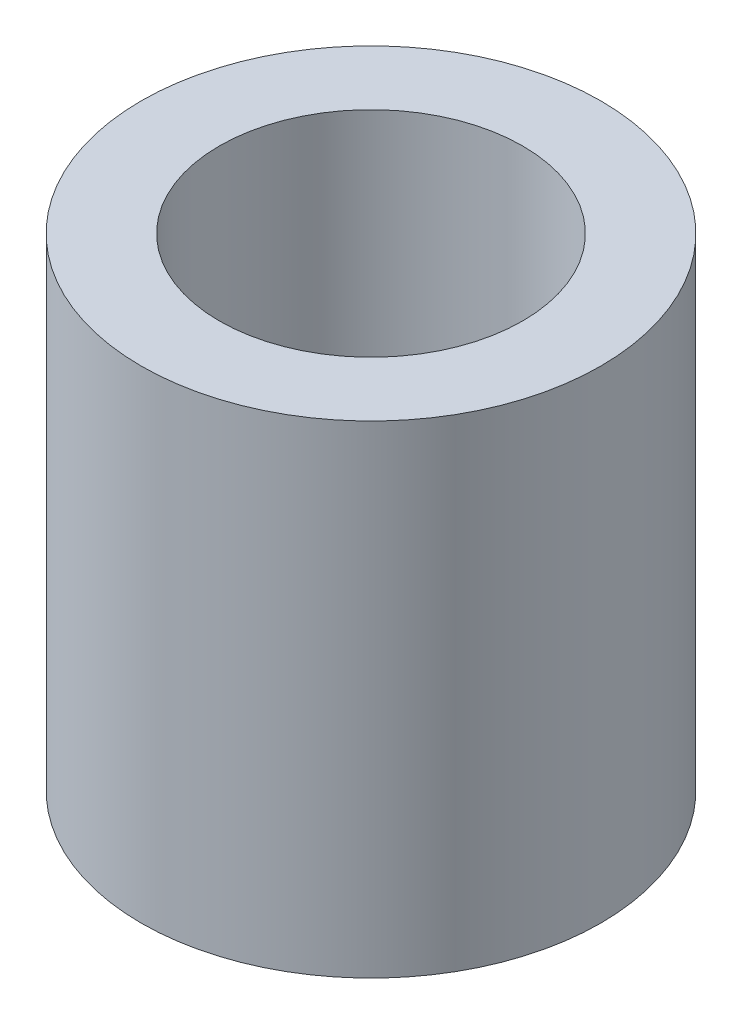
ISO-10303-21;
HEADER;
FILE_DESCRIPTION(('STEP AP214'),'2;1');
FILE_NAME('part.step','',(''),(''),'','','');
FILE_SCHEMA(('AUTOMOTIVE_DESIGN { 1 0 10303 214 1 1 1 1 }'));
ENDSEC;
DATA;
#1=APPLICATION_CONTEXT('core data for automotive mechanical design processes');
#2=APPLICATION_PROTOCOL_DEFINITION('international standard','automotive_design',2000,#1);
#3=PRODUCT_CONTEXT('',#1,'mechanical');
#4=PRODUCT('Part','Part','',(#3));
#5=PRODUCT_RELATED_PRODUCT_CATEGORY('part','',(#4));
#6=PRODUCT_DEFINITION_FORMATION('','',#4);
#7=PRODUCT_DEFINITION_CONTEXT('part definition',#1,'design');
#8=PRODUCT_DEFINITION('design','',#6,#7);
#9=PRODUCT_DEFINITION_SHAPE('','',#8);
#10=(LENGTH_UNIT() NAMED_UNIT(*) SI_UNIT(.MILLI.,.METRE.));
#11=(NAMED_UNIT(*) PLANE_ANGLE_UNIT() SI_UNIT($,.RADIAN.));
#12=(NAMED_UNIT(*) SI_UNIT($,.STERADIAN.) SOLID_ANGLE_UNIT());
#13=UNCERTAINTY_MEASURE_WITH_UNIT(LENGTH_MEASURE(1.E-05),#10,'distance_accuracy_value','');
#14=(GEOMETRIC_REPRESENTATION_CONTEXT(3) GLOBAL_UNCERTAINTY_ASSIGNED_CONTEXT((#13)) GLOBAL_UNIT_ASSIGNED_CONTEXT((#10,
#11,#12)) REPRESENTATION_CONTEXT('',''));
#15=CARTESIAN_POINT('',(0.,0.,0.));
#16=DIRECTION('',(0.,0.,1.));
#17=DIRECTION('',(1.,0.,0.));
#18=AXIS2_PLACEMENT_3D('',#15,#16,#17);
#19=CARTESIAN_POINT('',(0.,5.25,0.));
#20=DIRECTION('',(0.,1.,0.));
#21=DIRECTION('',(0.,0.,1.));
#22=AXIS2_PLACEMENT_3D('',#19,#20,#21);
#23=PLANE('',#22);
#24=CARTESIAN_POINT('',(0.,5.25,0.));
#25=DIRECTION('',(0.,1.,0.));
#26=DIRECTION('',(0.,0.,1.));
#27=AXIS2_PLACEMENT_3D('',#24,#25,#26);
#28=CIRCLE('',#27,2.5);
#29=CARTESIAN_POINT('',(0.,5.25,-2.5));
#30=VERTEX_POINT('',#29);
#31=EDGE_CURVE('E10',#30,#30,#28,.T.);
#32=ORIENTED_EDGE('',*,*,#31,.T.);
#33=EDGE_LOOP('',(#32));
#34=FACE_BOUND('',#33,.T.);
#35=CARTESIAN_POINT('',(0.,5.25,0.));
#36=DIRECTION('',(0.,1.,0.));
#37=DIRECTION('',(0.,0.,1.));
#38=AXIS2_PLACEMENT_3D('',#35,#36,#37);
#39=CIRCLE('',#38,1.65);
#40=CARTESIAN_POINT('',(0.,5.25,-1.65));
#41=VERTEX_POINT('',#40);
#42=EDGE_CURVE('E42',#41,#41,#39,.T.);
#43=ORIENTED_EDGE('',*,*,#42,.F.);
#44=EDGE_LOOP('',(#43));
#45=FACE_BOUND('',#44,.T.);
#46=ADVANCED_FACE('F31',(#34,#45),#23,.T.);
#47=CARTESIAN_POINT('',(0.,0.,0.));
#48=DIRECTION('',(0.,1.,0.));
#49=DIRECTION('',(0.,0.,1.));
#50=AXIS2_PLACEMENT_3D('',#47,#48,#49);
#51=PLANE('',#50);
#52=CARTESIAN_POINT('',(0.,0.,0.));
#53=DIRECTION('',(0.,1.,0.));
#54=DIRECTION('',(0.,0.,1.));
#55=AXIS2_PLACEMENT_3D('',#52,#53,#54);
#56=CIRCLE('',#55,2.5);
#57=CARTESIAN_POINT('',(0.,0.,-2.5));
#58=VERTEX_POINT('',#57);
#59=EDGE_CURVE('E35',#58,#58,#56,.T.);
#60=ORIENTED_EDGE('',*,*,#59,.F.);
#61=EDGE_LOOP('',(#60));
#62=FACE_BOUND('',#61,.T.);
#63=CARTESIAN_POINT('',(0.,0.,0.));
#64=DIRECTION('',(0.,1.,0.));
#65=DIRECTION('',(0.,0.,1.));
#66=AXIS2_PLACEMENT_3D('',#63,#64,#65);
#67=CIRCLE('',#66,1.65);
#68=CARTESIAN_POINT('',(0.,0.,-1.65));
#69=VERTEX_POINT('',#68);
#70=EDGE_CURVE('E44',#69,#69,#67,.T.);
#71=ORIENTED_EDGE('',*,*,#70,.T.);
#72=EDGE_LOOP('',(#71));
#73=FACE_BOUND('',#72,.T.);
#74=ADVANCED_FACE('F54',(#62,#73),#51,.F.);
#75=CARTESIAN_POINT('',(0.,5.25,0.));
#76=DIRECTION('',(0.,-1.,0.));
#77=DIRECTION('',(0.,0.,-1.));
#78=AXIS2_PLACEMENT_3D('',#75,#76,#77);
#79=CYLINDRICAL_SURFACE('',#78,2.5);
#80=CARTESIAN_POINT('',(0.,5.25,-2.5));
#81=CARTESIAN_POINT('',(0.,5.1953125,-2.5));
#82=CARTESIAN_POINT('',(0.,5.140625,-2.5));
#83=CARTESIAN_POINT('',(0.,5.03125,-2.5));
#84=CARTESIAN_POINT('',(0.,4.9765625,-2.5));
#85=CARTESIAN_POINT('',(0.,4.8671875,-2.5));
#86=CARTESIAN_POINT('',(0.,4.8125,-2.5));
#87=CARTESIAN_POINT('',(0.,4.703125,-2.5));
#88=CARTESIAN_POINT('',(0.,4.6484375,-2.5));
#89=CARTESIAN_POINT('',(0.,4.5390625,-2.5));
#90=CARTESIAN_POINT('',(0.,4.484375,-2.5));
#91=CARTESIAN_POINT('',(0.,4.375,-2.5));
#92=CARTESIAN_POINT('',(0.,4.3203125,-2.5));
#93=CARTESIAN_POINT('',(0.,4.2109375,-2.5));
#94=CARTESIAN_POINT('',(0.,4.15625,-2.5));
#95=CARTESIAN_POINT('',(0.,4.046875,-2.5));
#96=CARTESIAN_POINT('',(0.,3.9921875,-2.5));
#97=CARTESIAN_POINT('',(0.,3.8828125,-2.5));
#98=CARTESIAN_POINT('',(0.,3.828125,-2.5));
#99=CARTESIAN_POINT('',(0.,3.71875,-2.5));
#100=CARTESIAN_POINT('',(0.,3.6640625,-2.5));
#101=CARTESIAN_POINT('',(0.,3.5546875,-2.5));
#102=CARTESIAN_POINT('',(0.,3.5,-2.5));
#103=CARTESIAN_POINT('',(0.,3.390625,-2.5));
#104=CARTESIAN_POINT('',(0.,3.3359375,-2.5));
#105=CARTESIAN_POINT('',(0.,3.2265625,-2.5));
#106=CARTESIAN_POINT('',(0.,3.171875,-2.5));
#107=CARTESIAN_POINT('',(0.,3.0625,-2.5));
#108=CARTESIAN_POINT('',(0.,3.0078125,-2.5));
#109=CARTESIAN_POINT('',(0.,2.8984375,-2.5));
#110=CARTESIAN_POINT('',(0.,2.84375,-2.5));
#111=CARTESIAN_POINT('',(0.,2.734375,-2.5));
#112=CARTESIAN_POINT('',(0.,2.6796875,-2.5));
#113=CARTESIAN_POINT('',(0.,2.5703125,-2.5));
#114=CARTESIAN_POINT('',(0.,2.515625,-2.5));
#115=CARTESIAN_POINT('',(0.,2.40625,-2.5));
#116=CARTESIAN_POINT('',(0.,2.3515625,-2.5));
#117=CARTESIAN_POINT('',(0.,2.2421875,-2.5));
#118=CARTESIAN_POINT('',(0.,2.1875,-2.5));
#119=CARTESIAN_POINT('',(0.,2.078125,-2.5));
#120=CARTESIAN_POINT('',(0.,2.0234375,-2.5));
#121=CARTESIAN_POINT('',(0.,1.9140625,-2.5));
#122=CARTESIAN_POINT('',(0.,1.859375,-2.5));
#123=CARTESIAN_POINT('',(0.,1.75,-2.5));
#124=CARTESIAN_POINT('',(0.,1.6953125,-2.5));
#125=CARTESIAN_POINT('',(0.,1.5859375,-2.5));
#126=CARTESIAN_POINT('',(0.,1.53125,-2.5));
#127=CARTESIAN_POINT('',(0.,1.421875,-2.5));
#128=CARTESIAN_POINT('',(0.,1.3671875,-2.5));
#129=CARTESIAN_POINT('',(0.,1.2578125,-2.5));
#130=CARTESIAN_POINT('',(0.,1.203125,-2.5));
#131=CARTESIAN_POINT('',(0.,1.09375,-2.5));
#132=CARTESIAN_POINT('',(0.,1.0390625,-2.5));
#133=CARTESIAN_POINT('',(0.,0.9296875,-2.5));
#134=CARTESIAN_POINT('',(0.,0.875,-2.5));
#135=CARTESIAN_POINT('',(0.,0.765625,-2.5));
#136=CARTESIAN_POINT('',(0.,0.7109375,-2.5));
#137=CARTESIAN_POINT('',(0.,0.6015625,-2.5));
#138=CARTESIAN_POINT('',(0.,0.546875,-2.5));
#139=CARTESIAN_POINT('',(0.,0.4375,-2.5));
#140=CARTESIAN_POINT('',(0.,0.3828125,-2.5));
#141=CARTESIAN_POINT('',(0.,0.2734375,-2.5));
#142=CARTESIAN_POINT('',(0.,0.21875,-2.5));
#143=CARTESIAN_POINT('',(0.,0.109375,-2.5));
#144=CARTESIAN_POINT('',(0.,0.0546875,-2.5));
#145=CARTESIAN_POINT('',(0.,0.,-2.5));
#146=B_SPLINE_CURVE_WITH_KNOTS('',3,(#80,#81,#82,#83,#84,#85,#86,#87,#88,#89,#90,#91,#92,#93,
#94,#95,#96,#97,#98,#99,#100,#101,#102,#103,#104,#105,#106,#107,#108,#109,#110,#111,#112,#113,
#114,#115,#116,#117,#118,#119,#120,#121,#122,#123,#124,#125,#126,#127,#128,#129,#130,#131,#132,
#133,#134,#135,#136,#137,#138,#139,#140,#141,#142,#143,#144,#145),.UNSPECIFIED.,.F.,.F.,(4,2,2,
2,2,2,2,2,2,2,2,2,2,2,2,2,2,2,2,2,2,2,2,2,2,2,2,2,2,2,2,2,4),(0.,0.164062499999999,
0.328124999999999,0.4921875,0.65625,0.8203125,0.984374999999999,1.1484375,1.3125,1.4765625,
1.640625,1.8046875,1.96875,2.1328125,2.296875,2.4609375,2.625,2.7890625,2.953125,3.1171875,
3.28125,3.4453125,3.609375,3.7734375,3.9375,4.1015625,4.265625,4.4296875,4.59375,4.7578125,
4.921875,5.0859375,5.25),.UNSPECIFIED.);
#147=EDGE_CURVE('BSEAM33',#30,#58,#146,.T.);
#148=ORIENTED_EDGE('',*,*,#31,.F.);
#149=ORIENTED_EDGE('',*,*,#59,.T.);
#150=ORIENTED_EDGE('',*,*,#147,.T.);
#151=ORIENTED_EDGE('',*,*,#147,.F.);
#152=EDGE_LOOP('',(#148,#150,#149,#151));
#153=FACE_BOUND('',#152,.T.);
#154=ADVANCED_FACE('F33',(#153),#79,.T.);
#155=CARTESIAN_POINT('',(0.,5.25,0.));
#156=DIRECTION('',(0.,-1.,0.));
#157=DIRECTION('',(0.,0.,-1.));
#158=AXIS2_PLACEMENT_3D('',#155,#156,#157);
#159=CYLINDRICAL_SURFACE('',#158,1.65);
#160=CARTESIAN_POINT('',(0.,5.25,-1.65));
#161=CARTESIAN_POINT('',(0.,5.1953125,-1.65));
#162=CARTESIAN_POINT('',(0.,5.140625,-1.65));
#163=CARTESIAN_POINT('',(0.,5.03125,-1.65));
#164=CARTESIAN_POINT('',(0.,4.9765625,-1.65));
#165=CARTESIAN_POINT('',(0.,4.8671875,-1.65));
#166=CARTESIAN_POINT('',(0.,4.8125,-1.65));
#167=CARTESIAN_POINT('',(0.,4.703125,-1.65));
#168=CARTESIAN_POINT('',(0.,4.6484375,-1.65));
#169=CARTESIAN_POINT('',(0.,4.5390625,-1.65));
#170=CARTESIAN_POINT('',(0.,4.484375,-1.65));
#171=CARTESIAN_POINT('',(0.,4.375,-1.65));
#172=CARTESIAN_POINT('',(0.,4.3203125,-1.65));
#173=CARTESIAN_POINT('',(0.,4.2109375,-1.65));
#174=CARTESIAN_POINT('',(0.,4.15625,-1.65));
#175=CARTESIAN_POINT('',(0.,4.046875,-1.65));
#176=CARTESIAN_POINT('',(0.,3.9921875,-1.65));
#177=CARTESIAN_POINT('',(0.,3.8828125,-1.65));
#178=CARTESIAN_POINT('',(0.,3.828125,-1.65));
#179=CARTESIAN_POINT('',(0.,3.71875,-1.65));
#180=CARTESIAN_POINT('',(0.,3.6640625,-1.65));
#181=CARTESIAN_POINT('',(0.,3.5546875,-1.65));
#182=CARTESIAN_POINT('',(0.,3.5,-1.65));
#183=CARTESIAN_POINT('',(0.,3.390625,-1.65));
#184=CARTESIAN_POINT('',(0.,3.3359375,-1.65));
#185=CARTESIAN_POINT('',(0.,3.2265625,-1.65));
#186=CARTESIAN_POINT('',(0.,3.171875,-1.65));
#187=CARTESIAN_POINT('',(0.,3.0625,-1.65));
#188=CARTESIAN_POINT('',(0.,3.0078125,-1.65));
#189=CARTESIAN_POINT('',(0.,2.8984375,-1.65));
#190=CARTESIAN_POINT('',(0.,2.84375,-1.65));
#191=CARTESIAN_POINT('',(0.,2.734375,-1.65));
#192=CARTESIAN_POINT('',(0.,2.6796875,-1.65));
#193=CARTESIAN_POINT('',(0.,2.5703125,-1.65));
#194=CARTESIAN_POINT('',(0.,2.515625,-1.65));
#195=CARTESIAN_POINT('',(0.,2.40625,-1.65));
#196=CARTESIAN_POINT('',(0.,2.3515625,-1.65));
#197=CARTESIAN_POINT('',(0.,2.2421875,-1.65));
#198=CARTESIAN_POINT('',(0.,2.1875,-1.65));
#199=CARTESIAN_POINT('',(0.,2.078125,-1.65));
#200=CARTESIAN_POINT('',(0.,2.0234375,-1.65));
#201=CARTESIAN_POINT('',(0.,1.9140625,-1.65));
#202=CARTESIAN_POINT('',(0.,1.859375,-1.65));
#203=CARTESIAN_POINT('',(0.,1.75,-1.65));
#204=CARTESIAN_POINT('',(0.,1.6953125,-1.65));
#205=CARTESIAN_POINT('',(0.,1.5859375,-1.65));
#206=CARTESIAN_POINT('',(0.,1.53125,-1.65));
#207=CARTESIAN_POINT('',(0.,1.421875,-1.65));
#208=CARTESIAN_POINT('',(0.,1.3671875,-1.65));
#209=CARTESIAN_POINT('',(0.,1.2578125,-1.65));
#210=CARTESIAN_POINT('',(0.,1.203125,-1.65));
#211=CARTESIAN_POINT('',(0.,1.09375,-1.65));
#212=CARTESIAN_POINT('',(0.,1.0390625,-1.65));
#213=CARTESIAN_POINT('',(0.,0.9296875,-1.65));
#214=CARTESIAN_POINT('',(0.,0.875,-1.65));
#215=CARTESIAN_POINT('',(0.,0.765625,-1.65));
#216=CARTESIAN_POINT('',(0.,0.7109375,-1.65));
#217=CARTESIAN_POINT('',(0.,0.601562500000001,-1.65));
#218=CARTESIAN_POINT('',(0.,0.546875,-1.65));
#219=CARTESIAN_POINT('',(0.,0.4375,-1.65));
#220=CARTESIAN_POINT('',(0.,0.3828125,-1.65));
#221=CARTESIAN_POINT('',(0.,0.2734375,-1.65));
#222=CARTESIAN_POINT('',(0.,0.21875,-1.65));
#223=CARTESIAN_POINT('',(0.,0.109375,-1.65));
#224=CARTESIAN_POINT('',(0.,0.0546875,-1.65));
#225=CARTESIAN_POINT('',(0.,0.,-1.65));
#226=B_SPLINE_CURVE_WITH_KNOTS('',3,(#160,#161,#162,#163,#164,#165,#166,#167,#168,#169,#170,
#171,#172,#173,#174,#175,#176,#177,#178,#179,#180,#181,#182,#183,#184,#185,#186,#187,#188,#189,
#190,#191,#192,#193,#194,#195,#196,#197,#198,#199,#200,#201,#202,#203,#204,#205,#206,#207,#208,
#209,#210,#211,#212,#213,#214,#215,#216,#217,#218,#219,#220,#221,#222,#223,#224,#225),
.UNSPECIFIED.,.F.,.F.,(4,2,2,2,2,2,2,2,2,2,2,2,2,2,2,2,2,2,2,2,2,2,2,2,2,2,2,2,2,2,2,2,4),(0.,
0.1640625,0.328125,0.4921875,0.656250000000001,0.820312500000001,0.984375,1.1484375,1.3125,
1.4765625,1.640625,1.8046875,1.96875,2.1328125,2.296875,2.4609375,2.625,2.7890625,2.953125,
3.1171875,3.28125,3.4453125,3.609375,3.7734375,3.9375,4.1015625,4.265625,4.4296875,4.59375,
4.7578125,4.921875,5.0859375,5.25),.UNSPECIFIED.);
#227=EDGE_CURVE('BSEAM50',#41,#69,#226,.T.);
#228=ORIENTED_EDGE('',*,*,#42,.T.);
#229=ORIENTED_EDGE('',*,*,#70,.F.);
#230=ORIENTED_EDGE('',*,*,#227,.T.);
#231=ORIENTED_EDGE('',*,*,#227,.F.);
#232=EDGE_LOOP('',(#228,#230,#229,#231));
#233=FACE_BOUND('',#232,.T.);
#234=ADVANCED_FACE('F50',(#233),#159,.F.);
#235=CLOSED_SHELL('',(#46,#74,#154,#234));
#236=MANIFOLD_SOLID_BREP('B2',#235);
#237=ADVANCED_BREP_SHAPE_REPRESENTATION('',(#18,#236),#14);
#238=SHAPE_DEFINITION_REPRESENTATION(#9,#237);
ENDSEC;
END-ISO-10303-21;
